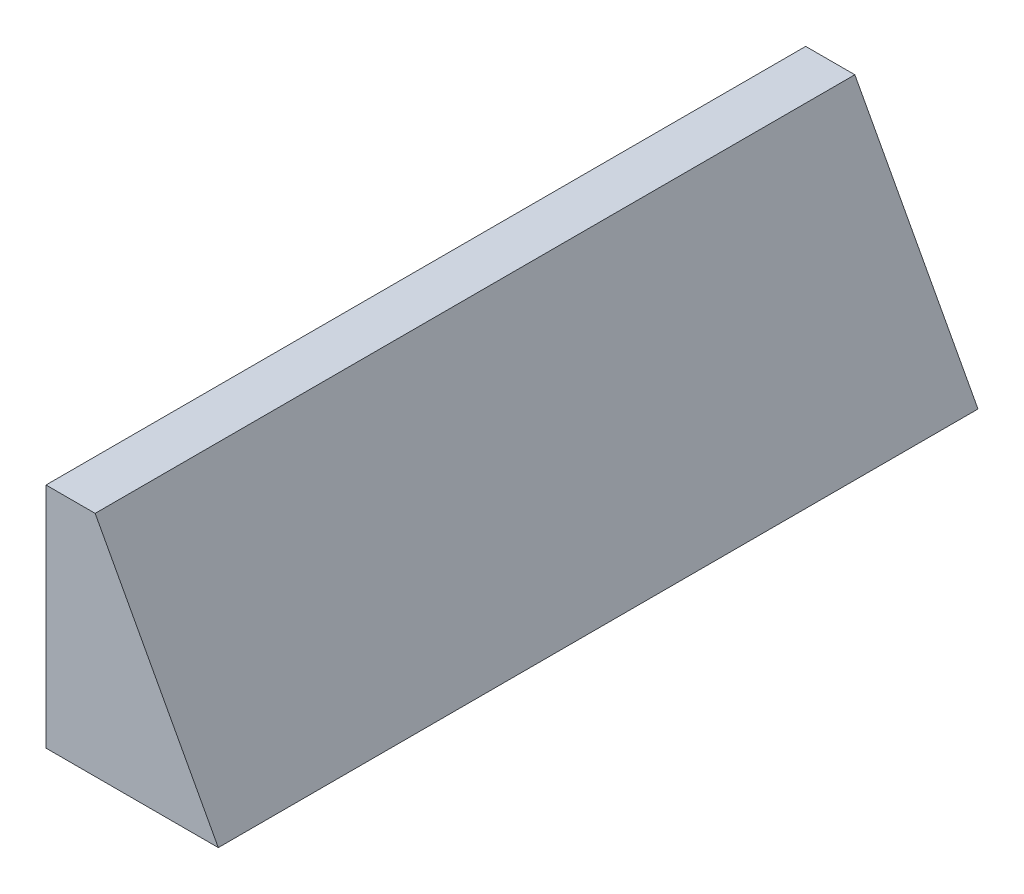
ISO-10303-21;
HEADER;
FILE_DESCRIPTION(('STEP AP214'),'2;1');
FILE_NAME('part.step','',(''),(''),'','','');
FILE_SCHEMA(('AUTOMOTIVE_DESIGN { 1 0 10303 214 1 1 1 1 }'));
ENDSEC;
DATA;
#1=APPLICATION_CONTEXT('core data for automotive mechanical design processes');
#2=APPLICATION_PROTOCOL_DEFINITION('international standard','automotive_design',2000,#1);
#3=PRODUCT_CONTEXT('',#1,'mechanical');
#4=PRODUCT('Part','Part','',(#3));
#5=PRODUCT_RELATED_PRODUCT_CATEGORY('part','',(#4));
#6=PRODUCT_DEFINITION_FORMATION('','',#4);
#7=PRODUCT_DEFINITION_CONTEXT('part definition',#1,'design');
#8=PRODUCT_DEFINITION('design','',#6,#7);
#9=PRODUCT_DEFINITION_SHAPE('','',#8);
#10=(LENGTH_UNIT() NAMED_UNIT(*) SI_UNIT(.MILLI.,.METRE.));
#11=(NAMED_UNIT(*) PLANE_ANGLE_UNIT() SI_UNIT($,.RADIAN.));
#12=(NAMED_UNIT(*) SI_UNIT($,.STERADIAN.) SOLID_ANGLE_UNIT());
#13=UNCERTAINTY_MEASURE_WITH_UNIT(LENGTH_MEASURE(1.E-05),#10,'distance_accuracy_value','');
#14=(GEOMETRIC_REPRESENTATION_CONTEXT(3) GLOBAL_UNCERTAINTY_ASSIGNED_CONTEXT((#13)) GLOBAL_UNIT_ASSIGNED_CONTEXT((#10,
#11,#12)) REPRESENTATION_CONTEXT('',''));
#15=CARTESIAN_POINT('',(0.,0.,0.));
#16=DIRECTION('',(0.,0.,1.));
#17=DIRECTION('',(1.,0.,0.));
#18=AXIS2_PLACEMENT_3D('',#15,#16,#17);
#19=CARTESIAN_POINT('',(3.23429928741093,15.,50.));
#20=DIRECTION('',(0.,-1.,0.));
#21=DIRECTION('',(1.,0.,0.));
#22=AXIS2_PLACEMENT_3D('',#19,#20,#21);
#23=PLANE('',#22);
#24=DIRECTION('',(-1.,0.,0.));
#25=VECTOR('',#24,1.);
#26=CARTESIAN_POINT('',(3.23429928741093,15.,0.));
#27=LINE('',#26,#25);
#28=CARTESIAN_POINT('',(3.23429928741093,15.,0.));
#29=VERTEX_POINT('',#28);
#30=CARTESIAN_POINT('',(0.,15.,0.));
#31=VERTEX_POINT('',#30);
#32=EDGE_CURVE('E107',#29,#31,#27,.T.);
#33=ORIENTED_EDGE('',*,*,#32,.T.);
#34=DIRECTION('',(0.,0.,-1.));
#35=VECTOR('',#34,1.);
#36=CARTESIAN_POINT('',(0.,15.,50.));
#37=LINE('',#36,#35);
#38=CARTESIAN_POINT('',(0.,15.,50.));
#39=VERTEX_POINT('',#38);
#40=EDGE_CURVE('E11',#39,#31,#37,.T.);
#41=ORIENTED_EDGE('',*,*,#40,.F.);
#42=DIRECTION('',(-1.,0.,0.));
#43=VECTOR('',#42,1.);
#44=CARTESIAN_POINT('',(3.23429928741093,15.,50.));
#45=LINE('',#44,#43);
#46=CARTESIAN_POINT('',(3.23429928741093,15.,50.));
#47=VERTEX_POINT('',#46);
#48=EDGE_CURVE('E91',#47,#39,#45,.T.);
#49=ORIENTED_EDGE('',*,*,#48,.F.);
#50=DIRECTION('',(0.,0.,-1.));
#51=VECTOR('',#50,1.);
#52=CARTESIAN_POINT('',(3.23429928741093,15.,50.));
#53=LINE('',#52,#51);
#54=EDGE_CURVE('E103',#47,#29,#53,.T.);
#55=ORIENTED_EDGE('',*,*,#54,.T.);
#56=EDGE_LOOP('',(#33,#41,#49,#55));
#57=FACE_BOUND('',#56,.T.);
#58=ADVANCED_FACE('F39',(#57),#23,.F.);
#59=CARTESIAN_POINT('',(0.,15.,50.));
#60=DIRECTION('',(1.,0.,0.));
#61=DIRECTION('',(0.,0.,-1.));
#62=AXIS2_PLACEMENT_3D('',#59,#60,#61);
#63=PLANE('',#62);
#64=DIRECTION('',(0.,-1.,0.));
#65=VECTOR('',#64,1.);
#66=CARTESIAN_POINT('',(0.,15.,0.));
#67=LINE('',#66,#65);
#68=CARTESIAN_POINT('',(0.,0.,0.));
#69=VERTEX_POINT('',#68);
#70=EDGE_CURVE('E96',#31,#69,#67,.T.);
#71=ORIENTED_EDGE('',*,*,#70,.T.);
#72=DIRECTION('',(0.,0.,-1.));
#73=VECTOR('',#72,1.);
#74=CARTESIAN_POINT('',(0.,0.,50.));
#75=LINE('',#74,#73);
#76=CARTESIAN_POINT('',(0.,0.,50.));
#77=VERTEX_POINT('',#76);
#78=EDGE_CURVE('E48',#77,#69,#75,.T.);
#79=ORIENTED_EDGE('',*,*,#78,.F.);
#80=DIRECTION('',(0.,-1.,0.));
#81=VECTOR('',#80,1.);
#82=CARTESIAN_POINT('',(0.,15.,50.));
#83=LINE('',#82,#81);
#84=EDGE_CURVE('E86',#39,#77,#83,.T.);
#85=ORIENTED_EDGE('',*,*,#84,.F.);
#86=ORIENTED_EDGE('',*,*,#40,.T.);
#87=EDGE_LOOP('',(#71,#79,#85,#86));
#88=FACE_BOUND('',#87,.T.);
#89=ADVANCED_FACE('F95',(#88),#63,.F.);
#90=CARTESIAN_POINT('',(0.,0.,50.));
#91=DIRECTION('',(0.,1.,0.));
#92=DIRECTION('',(0.,0.,1.));
#93=AXIS2_PLACEMENT_3D('',#90,#91,#92);
#94=PLANE('',#93);
#95=DIRECTION('',(1.,0.,0.));
#96=VECTOR('',#95,1.);
#97=CARTESIAN_POINT('',(0.,0.,0.));
#98=LINE('',#97,#96);
#99=CARTESIAN_POINT('',(11.34,0.,0.));
#100=VERTEX_POINT('',#99);
#101=EDGE_CURVE('E73',#69,#100,#98,.T.);
#102=ORIENTED_EDGE('',*,*,#101,.T.);
#103=DIRECTION('',(0.,0.,-1.));
#104=VECTOR('',#103,1.);
#105=CARTESIAN_POINT('',(11.34,0.,50.));
#106=LINE('',#105,#104);
#107=CARTESIAN_POINT('',(11.34,0.,50.));
#108=VERTEX_POINT('',#107);
#109=EDGE_CURVE('E98',#108,#100,#106,.T.);
#110=ORIENTED_EDGE('',*,*,#109,.F.);
#111=DIRECTION('',(1.,0.,0.));
#112=VECTOR('',#111,1.);
#113=CARTESIAN_POINT('',(0.,0.,50.));
#114=LINE('',#113,#112);
#115=EDGE_CURVE('E89',#77,#108,#114,.T.);
#116=ORIENTED_EDGE('',*,*,#115,.F.);
#117=ORIENTED_EDGE('',*,*,#78,.T.);
#118=EDGE_LOOP('',(#102,#110,#116,#117));
#119=FACE_BOUND('',#118,.T.);
#120=ADVANCED_FACE('F99',(#119),#94,.F.);
#121=CARTESIAN_POINT('',(11.34,0.,50.));
#122=DIRECTION('',(-0.879765571358704,-0.475407761244905,0.));
#123=DIRECTION('',(0.475407761244905,-0.879765571358704,0.));
#124=AXIS2_PLACEMENT_3D('',#121,#122,#123);
#125=PLANE('',#124);
#126=DIRECTION('',(-0.475407761244905,0.879765571358704,0.));
#127=VECTOR('',#126,1.);
#128=CARTESIAN_POINT('',(11.34,0.,0.));
#129=LINE('',#128,#127);
#130=EDGE_CURVE('E79',#100,#29,#129,.T.);
#131=ORIENTED_EDGE('',*,*,#130,.T.);
#132=ORIENTED_EDGE('',*,*,#54,.F.);
#133=DIRECTION('',(-0.475407761244905,0.879765571358704,0.));
#134=VECTOR('',#133,1.);
#135=CARTESIAN_POINT('',(11.34,0.,50.));
#136=LINE('',#135,#134);
#137=EDGE_CURVE('E56',#108,#47,#136,.T.);
#138=ORIENTED_EDGE('',*,*,#137,.F.);
#139=ORIENTED_EDGE('',*,*,#109,.T.);
#140=EDGE_LOOP('',(#131,#132,#138,#139));
#141=FACE_BOUND('',#140,.T.);
#142=ADVANCED_FACE('F120',(#141),#125,.F.);
#143=CARTESIAN_POINT('',(0.,0.,50.));
#144=DIRECTION('',(0.,0.,1.));
#145=DIRECTION('',(1.,0.,0.));
#146=AXIS2_PLACEMENT_3D('',#143,#144,#145);
#147=PLANE('',#146);
#148=ORIENTED_EDGE('',*,*,#48,.T.);
#149=ORIENTED_EDGE('',*,*,#84,.T.);
#150=ORIENTED_EDGE('',*,*,#115,.T.);
#151=ORIENTED_EDGE('',*,*,#137,.T.);
#152=EDGE_LOOP('',(#148,#149,#150,#151));
#153=FACE_BOUND('',#152,.T.);
#154=ADVANCED_FACE('F87',(#153),#147,.T.);
#155=CARTESIAN_POINT('',(0.,0.,0.));
#156=DIRECTION('',(0.,0.,1.));
#157=DIRECTION('',(1.,0.,0.));
#158=AXIS2_PLACEMENT_3D('',#155,#156,#157);
#159=PLANE('',#158);
#160=ORIENTED_EDGE('',*,*,#32,.F.);
#161=ORIENTED_EDGE('',*,*,#130,.F.);
#162=ORIENTED_EDGE('',*,*,#101,.F.);
#163=ORIENTED_EDGE('',*,*,#70,.F.);
#164=EDGE_LOOP('',(#160,#161,#162,#163));
#165=FACE_BOUND('',#164,.T.);
#166=ADVANCED_FACE('F123',(#165),#159,.F.);
#167=CLOSED_SHELL('',(#58,#89,#120,#142,#154,#166));
#168=MANIFOLD_SOLID_BREP('B2',#167);
#169=ADVANCED_BREP_SHAPE_REPRESENTATION('',(#18,#168),#14);
#170=SHAPE_DEFINITION_REPRESENTATION(#9,#169);
ENDSEC;
END-ISO-10303-21;
